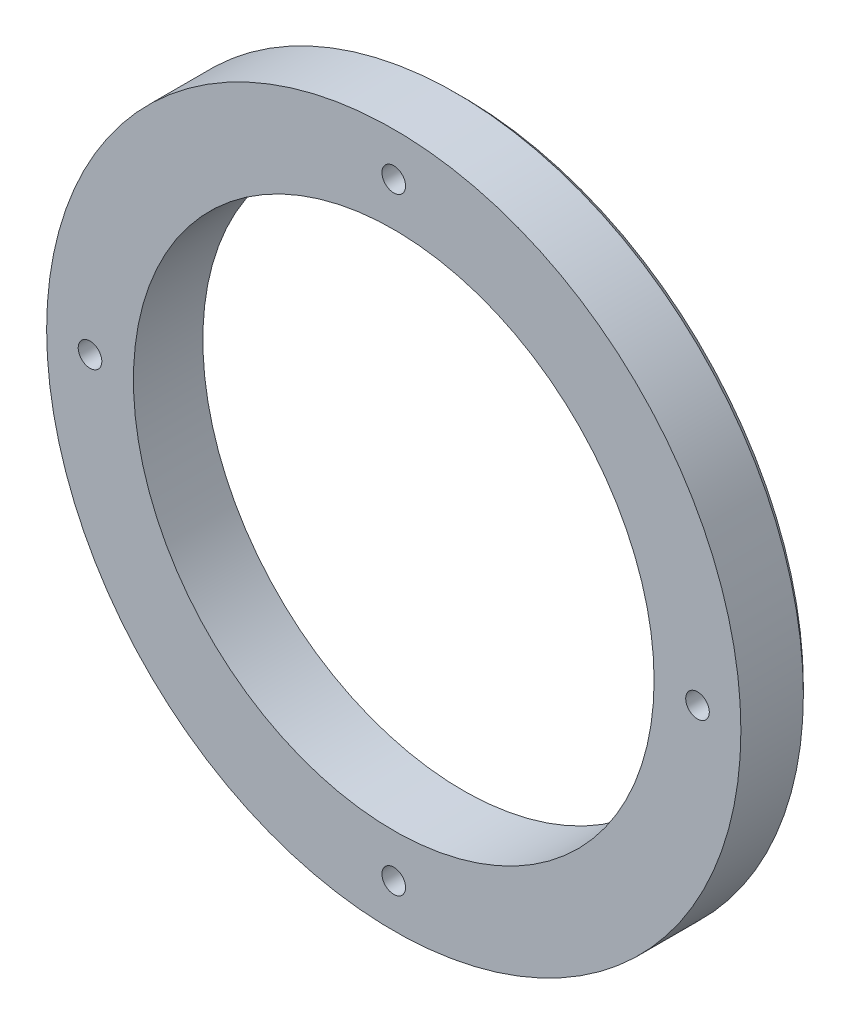
ISO-10303-21;
HEADER;
FILE_DESCRIPTION(('STEP AP214'),'2;1');
FILE_NAME('part.step','',(''),(''),'','','');
FILE_SCHEMA(('AUTOMOTIVE_DESIGN { 1 0 10303 214 1 1 1 1 }'));
ENDSEC;
DATA;
#1=APPLICATION_CONTEXT('core data for automotive mechanical design processes');
#2=APPLICATION_PROTOCOL_DEFINITION('international standard','automotive_design',2000,#1);
#3=PRODUCT_CONTEXT('',#1,'mechanical');
#4=PRODUCT('Part','Part','',(#3));
#5=PRODUCT_RELATED_PRODUCT_CATEGORY('part','',(#4));
#6=PRODUCT_DEFINITION_FORMATION('','',#4);
#7=PRODUCT_DEFINITION_CONTEXT('part definition',#1,'design');
#8=PRODUCT_DEFINITION('design','',#6,#7);
#9=PRODUCT_DEFINITION_SHAPE('','',#8);
#10=(LENGTH_UNIT() NAMED_UNIT(*) SI_UNIT(.MILLI.,.METRE.));
#11=(NAMED_UNIT(*) PLANE_ANGLE_UNIT() SI_UNIT($,.RADIAN.));
#12=(NAMED_UNIT(*) SI_UNIT($,.STERADIAN.) SOLID_ANGLE_UNIT());
#13=UNCERTAINTY_MEASURE_WITH_UNIT(LENGTH_MEASURE(1.E-05),#10,'distance_accuracy_value','');
#14=(GEOMETRIC_REPRESENTATION_CONTEXT(3) GLOBAL_UNCERTAINTY_ASSIGNED_CONTEXT((#13)) GLOBAL_UNIT_ASSIGNED_CONTEXT((#10,
#11,#12)) REPRESENTATION_CONTEXT('',''));
#15=CARTESIAN_POINT('',(0.,0.,0.));
#16=DIRECTION('',(0.,0.,1.));
#17=DIRECTION('',(1.,0.,0.));
#18=AXIS2_PLACEMENT_3D('',#15,#16,#17);
#19=CARTESIAN_POINT('',(0.,0.,10.));
#20=DIRECTION('',(0.,0.,1.));
#21=DIRECTION('',(1.,0.,0.));
#22=AXIS2_PLACEMENT_3D('',#19,#20,#21);
#23=PLANE('',#22);
#24=CARTESIAN_POINT('',(0.,-87.5,10.));
#25=DIRECTION('',(0.,0.,1.));
#26=DIRECTION('',(1.,0.,0.));
#27=AXIS2_PLACEMENT_3D('',#24,#25,#26);
#28=CIRCLE('',#27,3.4);
#29=CARTESIAN_POINT('',(3.4,-87.5,10.));
#30=VERTEX_POINT('',#29);
#31=EDGE_CURVE('E87',#30,#30,#28,.T.);
#32=ORIENTED_EDGE('',*,*,#31,.F.);
#33=EDGE_LOOP('',(#32));
#34=FACE_BOUND('',#33,.T.);
#35=CARTESIAN_POINT('',(0.,87.5,10.));
#36=DIRECTION('',(0.,0.,1.));
#37=DIRECTION('',(1.,0.,0.));
#38=AXIS2_PLACEMENT_3D('',#35,#36,#37);
#39=CIRCLE('',#38,3.4);
#40=CARTESIAN_POINT('',(3.4,87.5,10.));
#41=VERTEX_POINT('',#40);
#42=EDGE_CURVE('E71',#41,#41,#39,.T.);
#43=ORIENTED_EDGE('',*,*,#42,.F.);
#44=EDGE_LOOP('',(#43));
#45=FACE_BOUND('',#44,.T.);
#46=CARTESIAN_POINT('',(0.,0.,10.));
#47=DIRECTION('',(0.,0.,1.));
#48=DIRECTION('',(1.,0.,0.));
#49=AXIS2_PLACEMENT_3D('',#46,#47,#48);
#50=CIRCLE('',#49,100.);
#51=CARTESIAN_POINT('',(100.,0.,10.));
#52=VERTEX_POINT('',#51);
#53=EDGE_CURVE('E59',#52,#52,#50,.T.);
#54=ORIENTED_EDGE('',*,*,#53,.T.);
#55=EDGE_LOOP('',(#54));
#56=FACE_BOUND('',#55,.T.);
#57=CARTESIAN_POINT('',(0.,0.,10.));
#58=DIRECTION('',(0.,0.,1.));
#59=DIRECTION('',(1.,0.,0.));
#60=AXIS2_PLACEMENT_3D('',#57,#58,#59);
#61=CIRCLE('',#60,75.);
#62=CARTESIAN_POINT('',(75.,0.,10.));
#63=VERTEX_POINT('',#62);
#64=EDGE_CURVE('E64',#63,#63,#61,.T.);
#65=ORIENTED_EDGE('',*,*,#64,.F.);
#66=EDGE_LOOP('',(#65));
#67=FACE_BOUND('',#66,.T.);
#68=CARTESIAN_POINT('',(87.5,0.,10.));
#69=DIRECTION('',(0.,0.,1.));
#70=DIRECTION('',(1.,0.,0.));
#71=AXIS2_PLACEMENT_3D('',#68,#69,#70);
#72=CIRCLE('',#71,3.4);
#73=CARTESIAN_POINT('',(90.9,0.,10.));
#74=VERTEX_POINT('',#73);
#75=EDGE_CURVE('E79',#74,#74,#72,.T.);
#76=ORIENTED_EDGE('',*,*,#75,.F.);
#77=EDGE_LOOP('',(#76));
#78=FACE_BOUND('',#77,.T.);
#79=CARTESIAN_POINT('',(-87.5,0.,10.));
#80=DIRECTION('',(0.,0.,1.));
#81=DIRECTION('',(1.,0.,0.));
#82=AXIS2_PLACEMENT_3D('',#79,#80,#81);
#83=CIRCLE('',#82,3.4);
#84=CARTESIAN_POINT('',(-84.1,0.,10.));
#85=VERTEX_POINT('',#84);
#86=EDGE_CURVE('E95',#85,#85,#83,.T.);
#87=ORIENTED_EDGE('',*,*,#86,.F.);
#88=EDGE_LOOP('',(#87));
#89=FACE_BOUND('',#88,.T.);
#90=ADVANCED_FACE('F45',(#34,#45,#56,#67,#78,#89),#23,.T.);
#91=CARTESIAN_POINT('',(0.,0.,-10.));
#92=DIRECTION('',(0.,0.,1.));
#93=DIRECTION('',(1.,0.,0.));
#94=AXIS2_PLACEMENT_3D('',#91,#92,#93);
#95=PLANE('',#94);
#96=CARTESIAN_POINT('',(0.,0.,-10.));
#97=DIRECTION('',(0.,0.,1.));
#98=DIRECTION('',(1.,0.,0.));
#99=AXIS2_PLACEMENT_3D('',#96,#97,#98);
#100=CIRCLE('',#99,98.);
#101=CARTESIAN_POINT('',(98.,0.,-10.));
#102=VERTEX_POINT('',#101);
#103=EDGE_CURVE('E10',#102,#102,#100,.F.);
#104=ORIENTED_EDGE('',*,*,#103,.T.);
#105=EDGE_LOOP('',(#104));
#106=FACE_BOUND('',#105,.T.);
#107=CARTESIAN_POINT('',(0.,0.,-10.));
#108=DIRECTION('',(0.,0.,1.));
#109=DIRECTION('',(1.,0.,0.));
#110=AXIS2_PLACEMENT_3D('',#107,#108,#109);
#111=CIRCLE('',#110,75.);
#112=CARTESIAN_POINT('',(75.,0.,-10.));
#113=VERTEX_POINT('',#112);
#114=EDGE_CURVE('E67',#113,#113,#111,.T.);
#115=ORIENTED_EDGE('',*,*,#114,.T.);
#116=EDGE_LOOP('',(#115));
#117=FACE_BOUND('',#116,.T.);
#118=CARTESIAN_POINT('',(0.,87.5,-10.));
#119=DIRECTION('',(0.,0.,1.));
#120=DIRECTION('',(1.,0.,0.));
#121=AXIS2_PLACEMENT_3D('',#118,#119,#120);
#122=CIRCLE('',#121,3.4);
#123=CARTESIAN_POINT('',(3.4,87.5,-10.));
#124=VERTEX_POINT('',#123);
#125=EDGE_CURVE('E75',#124,#124,#122,.T.);
#126=ORIENTED_EDGE('',*,*,#125,.T.);
#127=EDGE_LOOP('',(#126));
#128=FACE_BOUND('',#127,.T.);
#129=CARTESIAN_POINT('',(87.5,0.,-10.));
#130=DIRECTION('',(0.,0.,1.));
#131=DIRECTION('',(1.,0.,0.));
#132=AXIS2_PLACEMENT_3D('',#129,#130,#131);
#133=CIRCLE('',#132,3.4);
#134=CARTESIAN_POINT('',(90.9,0.,-10.));
#135=VERTEX_POINT('',#134);
#136=EDGE_CURVE('E83',#135,#135,#133,.T.);
#137=ORIENTED_EDGE('',*,*,#136,.T.);
#138=EDGE_LOOP('',(#137));
#139=FACE_BOUND('',#138,.T.);
#140=CARTESIAN_POINT('',(0.,-87.5,-10.));
#141=DIRECTION('',(0.,0.,1.));
#142=DIRECTION('',(1.,0.,0.));
#143=AXIS2_PLACEMENT_3D('',#140,#141,#142);
#144=CIRCLE('',#143,3.4);
#145=CARTESIAN_POINT('',(3.4,-87.5,-10.));
#146=VERTEX_POINT('',#145);
#147=EDGE_CURVE('E91',#146,#146,#144,.T.);
#148=ORIENTED_EDGE('',*,*,#147,.T.);
#149=EDGE_LOOP('',(#148));
#150=FACE_BOUND('',#149,.T.);
#151=CARTESIAN_POINT('',(-87.5,0.,-10.));
#152=DIRECTION('',(0.,0.,1.));
#153=DIRECTION('',(1.,0.,0.));
#154=AXIS2_PLACEMENT_3D('',#151,#152,#153);
#155=CIRCLE('',#154,3.4);
#156=CARTESIAN_POINT('',(-84.1,0.,-10.));
#157=VERTEX_POINT('',#156);
#158=EDGE_CURVE('E99',#157,#157,#155,.T.);
#159=ORIENTED_EDGE('',*,*,#158,.T.);
#160=EDGE_LOOP('',(#159));
#161=FACE_BOUND('',#160,.T.);
#162=ADVANCED_FACE('F111',(#106,#117,#128,#139,#150,#161),#95,.F.);
#163=CARTESIAN_POINT('',(0.,0.,10.));
#164=DIRECTION('',(0.,0.,-1.));
#165=DIRECTION('',(-1.,0.,0.));
#166=AXIS2_PLACEMENT_3D('',#163,#164,#165);
#167=CYLINDRICAL_SURFACE('',#166,100.);
#168=CARTESIAN_POINT('',(0.,0.,-7.99999999999997));
#169=DIRECTION('',(0.,0.,1.));
#170=DIRECTION('',(1.,0.,0.));
#171=AXIS2_PLACEMENT_3D('',#168,#169,#170);
#172=CIRCLE('',#171,100.);
#173=CARTESIAN_POINT('',(100.,0.,-7.99999999999997));
#174=VERTEX_POINT('',#173);
#175=EDGE_CURVE('E54',#174,#174,#172,.T.);
#176=ORIENTED_EDGE('',*,*,#175,.T.);
#177=EDGE_LOOP('',(#176));
#178=FACE_BOUND('',#177,.T.);
#179=ORIENTED_EDGE('',*,*,#53,.F.);
#180=EDGE_LOOP('',(#179));
#181=FACE_BOUND('',#180,.T.);
#182=ADVANCED_FACE('F117',(#178,#181),#167,.T.);
#183=CARTESIAN_POINT('',(0.,0.,10.));
#184=DIRECTION('',(0.,0.,-1.));
#185=DIRECTION('',(-1.,0.,0.));
#186=AXIS2_PLACEMENT_3D('',#183,#184,#185);
#187=CYLINDRICAL_SURFACE('',#186,75.);
#188=ORIENTED_EDGE('',*,*,#64,.T.);
#189=EDGE_LOOP('',(#188));
#190=FACE_BOUND('',#189,.T.);
#191=ORIENTED_EDGE('',*,*,#114,.F.);
#192=EDGE_LOOP('',(#191));
#193=FACE_BOUND('',#192,.T.);
#194=ADVANCED_FACE('F122',(#190,#193),#187,.F.);
#195=CARTESIAN_POINT('',(0.,87.5,10.));
#196=DIRECTION('',(0.,0.,-1.));
#197=DIRECTION('',(-1.,0.,0.));
#198=AXIS2_PLACEMENT_3D('',#195,#196,#197);
#199=CYLINDRICAL_SURFACE('',#198,3.4);
#200=ORIENTED_EDGE('',*,*,#42,.T.);
#201=EDGE_LOOP('',(#200));
#202=FACE_BOUND('',#201,.T.);
#203=ORIENTED_EDGE('',*,*,#125,.F.);
#204=EDGE_LOOP('',(#203));
#205=FACE_BOUND('',#204,.T.);
#206=ADVANCED_FACE('F128',(#202,#205),#199,.F.);
#207=CARTESIAN_POINT('',(87.5,0.,10.));
#208=DIRECTION('',(0.,0.,-1.));
#209=DIRECTION('',(-1.,0.,0.));
#210=AXIS2_PLACEMENT_3D('',#207,#208,#209);
#211=CYLINDRICAL_SURFACE('',#210,3.4);
#212=ORIENTED_EDGE('',*,*,#75,.T.);
#213=EDGE_LOOP('',(#212));
#214=FACE_BOUND('',#213,.T.);
#215=ORIENTED_EDGE('',*,*,#136,.F.);
#216=EDGE_LOOP('',(#215));
#217=FACE_BOUND('',#216,.T.);
#218=ADVANCED_FACE('F138',(#214,#217),#211,.F.);
#219=CARTESIAN_POINT('',(0.,-87.5,10.));
#220=DIRECTION('',(0.,0.,-1.));
#221=DIRECTION('',(-1.,0.,0.));
#222=AXIS2_PLACEMENT_3D('',#219,#220,#221);
#223=CYLINDRICAL_SURFACE('',#222,3.4);
#224=ORIENTED_EDGE('',*,*,#31,.T.);
#225=EDGE_LOOP('',(#224));
#226=FACE_BOUND('',#225,.T.);
#227=ORIENTED_EDGE('',*,*,#147,.F.);
#228=EDGE_LOOP('',(#227));
#229=FACE_BOUND('',#228,.T.);
#230=ADVANCED_FACE('F141',(#226,#229),#223,.F.);
#231=CARTESIAN_POINT('',(-87.5,0.,10.));
#232=DIRECTION('',(0.,0.,-1.));
#233=DIRECTION('',(-1.,0.,0.));
#234=AXIS2_PLACEMENT_3D('',#231,#232,#233);
#235=CYLINDRICAL_SURFACE('',#234,3.4);
#236=ORIENTED_EDGE('',*,*,#86,.T.);
#237=EDGE_LOOP('',(#236));
#238=FACE_BOUND('',#237,.T.);
#239=ORIENTED_EDGE('',*,*,#158,.F.);
#240=EDGE_LOOP('',(#239));
#241=FACE_BOUND('',#240,.T.);
#242=ADVANCED_FACE('F107',(#238,#241),#235,.F.);
#243=CARTESIAN_POINT('',(0.,0.,-7.99999999999997));
#244=DIRECTION('',(0.,0.,1.));
#245=DIRECTION('',(1.,0.,0.));
#246=AXIS2_PLACEMENT_3D('',#243,#244,#245);
#247=CONICAL_SURFACE('',#246,100.,0.785398163397452);
#248=ORIENTED_EDGE('',*,*,#103,.F.);
#249=EDGE_LOOP('',(#248));
#250=FACE_BOUND('',#249,.T.);
#251=ORIENTED_EDGE('',*,*,#175,.F.);
#252=EDGE_LOOP('',(#251));
#253=FACE_BOUND('',#252,.T.);
#254=ADVANCED_FACE('F48',(#250,#253),#247,.T.);
#255=CLOSED_SHELL('',(#90,#162,#182,#194,#206,#218,#230,#242,#254));
#256=MANIFOLD_SOLID_BREP('B2',#255);
#257=ADVANCED_BREP_SHAPE_REPRESENTATION('',(#18,#256),#14);
#258=SHAPE_DEFINITION_REPRESENTATION(#9,#257);
ENDSEC;
END-ISO-10303-21;
